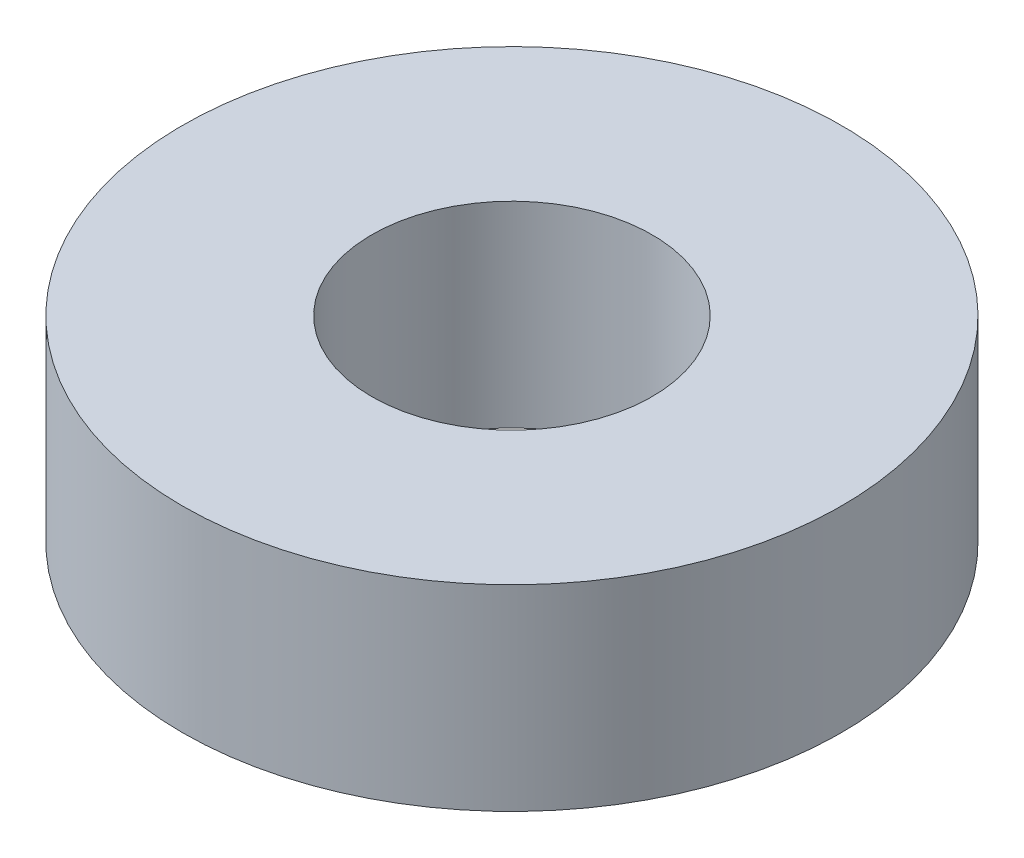
ISO-10303-21;
HEADER;
FILE_DESCRIPTION(('STEP AP214'),'2;1');
FILE_NAME('part.step','',(''),(''),'','','');
FILE_SCHEMA(('AUTOMOTIVE_DESIGN { 1 0 10303 214 1 1 1 1 }'));
ENDSEC;
DATA;
#1=APPLICATION_CONTEXT('core data for automotive mechanical design processes');
#2=APPLICATION_PROTOCOL_DEFINITION('international standard','automotive_design',2000,#1);
#3=PRODUCT_CONTEXT('',#1,'mechanical');
#4=PRODUCT('Part','Part','',(#3));
#5=PRODUCT_RELATED_PRODUCT_CATEGORY('part','',(#4));
#6=PRODUCT_DEFINITION_FORMATION('','',#4);
#7=PRODUCT_DEFINITION_CONTEXT('part definition',#1,'design');
#8=PRODUCT_DEFINITION('design','',#6,#7);
#9=PRODUCT_DEFINITION_SHAPE('','',#8);
#10=(LENGTH_UNIT() NAMED_UNIT(*) SI_UNIT(.MILLI.,.METRE.));
#11=(NAMED_UNIT(*) PLANE_ANGLE_UNIT() SI_UNIT($,.RADIAN.));
#12=(NAMED_UNIT(*) SI_UNIT($,.STERADIAN.) SOLID_ANGLE_UNIT());
#13=UNCERTAINTY_MEASURE_WITH_UNIT(LENGTH_MEASURE(1.E-05),#10,'distance_accuracy_value','');
#14=(GEOMETRIC_REPRESENTATION_CONTEXT(3) GLOBAL_UNCERTAINTY_ASSIGNED_CONTEXT((#13)) GLOBAL_UNIT_ASSIGNED_CONTEXT((#10,
#11,#12)) REPRESENTATION_CONTEXT('',''));
#15=CARTESIAN_POINT('',(0.,0.,0.));
#16=DIRECTION('',(0.,0.,1.));
#17=DIRECTION('',(1.,0.,0.));
#18=AXIS2_PLACEMENT_3D('',#15,#16,#17);
#19=CARTESIAN_POINT('',(0.,14.,0.));
#20=DIRECTION('',(0.,1.,0.));
#21=DIRECTION('',(0.,0.,1.));
#22=AXIS2_PLACEMENT_3D('',#19,#20,#21);
#23=PLANE('',#22);
#24=CARTESIAN_POINT('',(0.,14.,0.));
#25=DIRECTION('',(0.,1.,0.));
#26=DIRECTION('',(0.,0.,1.));
#27=AXIS2_PLACEMENT_3D('',#24,#25,#26);
#28=CIRCLE('',#27,23.5);
#29=CARTESIAN_POINT('',(0.,14.,23.5));
#30=VERTEX_POINT('',#29);
#31=EDGE_CURVE('E10',#30,#30,#28,.T.);
#32=ORIENTED_EDGE('',*,*,#31,.T.);
#33=EDGE_LOOP('',(#32));
#34=FACE_BOUND('',#33,.T.);
#35=CARTESIAN_POINT('',(0.,14.,0.));
#36=DIRECTION('',(0.,1.,0.));
#37=DIRECTION('',(0.,0.,1.));
#38=AXIS2_PLACEMENT_3D('',#35,#36,#37);
#39=CIRCLE('',#38,10.);
#40=CARTESIAN_POINT('',(0.,14.,10.));
#41=VERTEX_POINT('',#40);
#42=EDGE_CURVE('E48',#41,#41,#39,.T.);
#43=ORIENTED_EDGE('',*,*,#42,.F.);
#44=EDGE_LOOP('',(#43));
#45=FACE_BOUND('',#44,.T.);
#46=ADVANCED_FACE('F40',(#34,#45),#23,.T.);
#47=CARTESIAN_POINT('',(0.,0.,0.));
#48=DIRECTION('',(0.,1.,0.));
#49=DIRECTION('',(0.,0.,1.));
#50=AXIS2_PLACEMENT_3D('',#47,#48,#49);
#51=PLANE('',#50);
#52=CARTESIAN_POINT('',(0.,0.,0.));
#53=DIRECTION('',(0.,1.,0.));
#54=DIRECTION('',(0.,0.,1.));
#55=AXIS2_PLACEMENT_3D('',#52,#53,#54);
#56=CIRCLE('',#55,23.5);
#57=CARTESIAN_POINT('',(0.,0.,23.5));
#58=VERTEX_POINT('',#57);
#59=EDGE_CURVE('E41',#58,#58,#56,.T.);
#60=ORIENTED_EDGE('',*,*,#59,.F.);
#61=EDGE_LOOP('',(#60));
#62=FACE_BOUND('',#61,.T.);
#63=CARTESIAN_POINT('',(0.,0.,0.));
#64=DIRECTION('',(0.,1.,0.));
#65=DIRECTION('',(0.,0.,1.));
#66=AXIS2_PLACEMENT_3D('',#63,#64,#65);
#67=CIRCLE('',#66,10.);
#68=CARTESIAN_POINT('',(0.,0.,10.));
#69=VERTEX_POINT('',#68);
#70=EDGE_CURVE('E49',#69,#69,#67,.T.);
#71=ORIENTED_EDGE('',*,*,#70,.T.);
#72=EDGE_LOOP('',(#71));
#73=FACE_BOUND('',#72,.T.);
#74=ADVANCED_FACE('F58',(#62,#73),#51,.F.);
#75=CARTESIAN_POINT('',(0.,14.,0.));
#76=DIRECTION('',(0.,-1.,0.));
#77=DIRECTION('',(0.,0.,-1.));
#78=AXIS2_PLACEMENT_3D('',#75,#76,#77);
#79=CYLINDRICAL_SURFACE('',#78,23.5);
#80=ORIENTED_EDGE('',*,*,#31,.F.);
#81=EDGE_LOOP('',(#80));
#82=FACE_BOUND('',#81,.T.);
#83=ORIENTED_EDGE('',*,*,#59,.T.);
#84=EDGE_LOOP('',(#83));
#85=FACE_BOUND('',#84,.T.);
#86=ADVANCED_FACE('F39',(#82,#85),#79,.T.);
#87=CARTESIAN_POINT('',(0.,14.,0.));
#88=DIRECTION('',(0.,-1.,0.));
#89=DIRECTION('',(0.,0.,-1.));
#90=AXIS2_PLACEMENT_3D('',#87,#88,#89);
#91=CYLINDRICAL_SURFACE('',#90,10.);
#92=ORIENTED_EDGE('',*,*,#42,.T.);
#93=EDGE_LOOP('',(#92));
#94=FACE_BOUND('',#93,.T.);
#95=ORIENTED_EDGE('',*,*,#70,.F.);
#96=EDGE_LOOP('',(#95));
#97=FACE_BOUND('',#96,.T.);
#98=ADVANCED_FACE('F57',(#94,#97),#91,.F.);
#99=CLOSED_SHELL('',(#46,#74,#86,#98));
#100=MANIFOLD_SOLID_BREP('B2',#99);
#101=ADVANCED_BREP_SHAPE_REPRESENTATION('',(#18,#100),#14);
#102=SHAPE_DEFINITION_REPRESENTATION(#9,#101);
ENDSEC;
END-ISO-10303-21;
